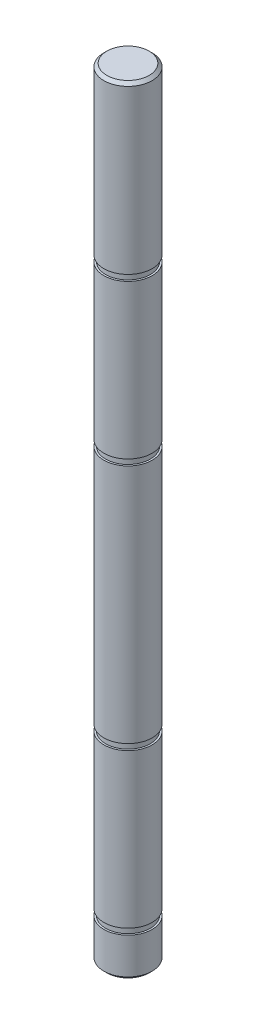
ISO-10303-21;
HEADER;
FILE_DESCRIPTION(('STEP AP214'),'2;1');
FILE_NAME('part.step','',(''),(''),'','','');
FILE_SCHEMA(('AUTOMOTIVE_DESIGN { 1 0 10303 214 1 1 1 1 }'));
ENDSEC;
DATA;
#1=APPLICATION_CONTEXT('core data for automotive mechanical design processes');
#2=APPLICATION_PROTOCOL_DEFINITION('international standard','automotive_design',2000,#1);
#3=PRODUCT_CONTEXT('',#1,'mechanical');
#4=PRODUCT('Part','Part','',(#3));
#5=PRODUCT_RELATED_PRODUCT_CATEGORY('part','',(#4));
#6=PRODUCT_DEFINITION_FORMATION('','',#4);
#7=PRODUCT_DEFINITION_CONTEXT('part definition',#1,'design');
#8=PRODUCT_DEFINITION('design','',#6,#7);
#9=PRODUCT_DEFINITION_SHAPE('','',#8);
#10=(LENGTH_UNIT() NAMED_UNIT(*) SI_UNIT(.MILLI.,.METRE.));
#11=(NAMED_UNIT(*) PLANE_ANGLE_UNIT() SI_UNIT($,.RADIAN.));
#12=(NAMED_UNIT(*) SI_UNIT($,.STERADIAN.) SOLID_ANGLE_UNIT());
#13=UNCERTAINTY_MEASURE_WITH_UNIT(LENGTH_MEASURE(1.E-05),#10,'distance_accuracy_value','');
#14=(GEOMETRIC_REPRESENTATION_CONTEXT(3) GLOBAL_UNCERTAINTY_ASSIGNED_CONTEXT((#13)) GLOBAL_UNIT_ASSIGNED_CONTEXT((#10,
#11,#12)) REPRESENTATION_CONTEXT('',''));
#15=CARTESIAN_POINT('',(0.,0.,0.));
#16=DIRECTION('',(0.,0.,1.));
#17=DIRECTION('',(1.,0.,0.));
#18=AXIS2_PLACEMENT_3D('',#15,#16,#17);
#19=CARTESIAN_POINT('',(0.,117.,0.));
#20=DIRECTION('',(0.,-1.,0.));
#21=DIRECTION('',(0.,0.,-1.));
#22=AXIS2_PLACEMENT_3D('',#19,#20,#21);
#23=CYLINDRICAL_SURFACE('',#22,4.);
#24=CARTESIAN_POINT('',(0.,29.13,0.));
#25=DIRECTION('',(0.,-1.,0.));
#26=DIRECTION('',(0.,0.,-1.));
#27=AXIS2_PLACEMENT_3D('',#24,#25,#26);
#28=CIRCLE('',#27,4.);
#29=CARTESIAN_POINT('',(0.,29.13,-4.));
#30=VERTEX_POINT('',#29);
#31=EDGE_CURVE('E81',#30,#30,#28,.T.);
#32=ORIENTED_EDGE('',*,*,#31,.F.);
#33=EDGE_LOOP('',(#32));
#34=FACE_BOUND('',#33,.T.);
#35=CARTESIAN_POINT('',(0.,69.,0.));
#36=DIRECTION('',(0.,1.,0.));
#37=DIRECTION('',(0.,0.,1.));
#38=AXIS2_PLACEMENT_3D('',#35,#36,#37);
#39=CIRCLE('',#38,4.);
#40=CARTESIAN_POINT('',(0.,69.,4.));
#41=VERTEX_POINT('',#40);
#42=EDGE_CURVE('E93',#41,#41,#39,.T.);
#43=ORIENTED_EDGE('',*,*,#42,.F.);
#44=EDGE_LOOP('',(#43));
#45=FACE_BOUND('',#44,.T.);
#46=ADVANCED_FACE('F39',(#34,#45),#23,.T.);
#47=CARTESIAN_POINT('',(0.,29.13,0.));
#48=DIRECTION('',(0.,-1.,0.));
#49=DIRECTION('',(0.,0.,-1.));
#50=AXIS2_PLACEMENT_3D('',#47,#48,#49);
#51=PLANE('',#50);
#52=CARTESIAN_POINT('',(0.,29.13,0.));
#53=DIRECTION('',(0.,-1.,0.));
#54=DIRECTION('',(0.,0.,-1.));
#55=AXIS2_PLACEMENT_3D('',#52,#53,#54);
#56=CIRCLE('',#55,3.7);
#57=CARTESIAN_POINT('',(0.,29.13,-3.7));
#58=VERTEX_POINT('',#57);
#59=EDGE_CURVE('E87',#58,#58,#56,.T.);
#60=ORIENTED_EDGE('',*,*,#59,.F.);
#61=EDGE_LOOP('',(#60));
#62=FACE_BOUND('',#61,.T.);
#63=ORIENTED_EDGE('',*,*,#31,.T.);
#64=EDGE_LOOP('',(#63));
#65=FACE_BOUND('',#64,.T.);
#66=ADVANCED_FACE('F120',(#62,#65),#51,.T.);
#67=CARTESIAN_POINT('',(0.,28.13,0.));
#68=DIRECTION('',(0.,-1.,0.));
#69=DIRECTION('',(0.,0.,-1.));
#70=AXIS2_PLACEMENT_3D('',#67,#68,#69);
#71=PLANE('',#70);
#72=CARTESIAN_POINT('',(0.,28.13,0.));
#73=DIRECTION('',(0.,-1.,0.));
#74=DIRECTION('',(0.,0.,-1.));
#75=AXIS2_PLACEMENT_3D('',#72,#73,#74);
#76=CIRCLE('',#75,3.7);
#77=CARTESIAN_POINT('',(0.,28.13,-3.7));
#78=VERTEX_POINT('',#77);
#79=EDGE_CURVE('E90',#78,#78,#76,.T.);
#80=ORIENTED_EDGE('',*,*,#79,.T.);
#81=EDGE_LOOP('',(#80));
#82=FACE_BOUND('',#81,.T.);
#83=CARTESIAN_POINT('',(0.,28.13,0.));
#84=DIRECTION('',(0.,-1.,0.));
#85=DIRECTION('',(0.,0.,-1.));
#86=AXIS2_PLACEMENT_3D('',#83,#84,#85);
#87=CIRCLE('',#86,4.);
#88=CARTESIAN_POINT('',(0.,28.13,-4.));
#89=VERTEX_POINT('',#88);
#90=EDGE_CURVE('E84',#89,#89,#87,.T.);
#91=ORIENTED_EDGE('',*,*,#90,.F.);
#92=EDGE_LOOP('',(#91));
#93=FACE_BOUND('',#92,.T.);
#94=ADVANCED_FACE('F129',(#82,#93),#71,.F.);
#95=CARTESIAN_POINT('',(0.,29.13,0.));
#96=DIRECTION('',(0.,-1.,0.));
#97=DIRECTION('',(0.,0.,-1.));
#98=AXIS2_PLACEMENT_3D('',#95,#96,#97);
#99=CYLINDRICAL_SURFACE('',#98,3.7);
#100=ORIENTED_EDGE('',*,*,#59,.T.);
#101=EDGE_LOOP('',(#100));
#102=FACE_BOUND('',#101,.T.);
#103=ORIENTED_EDGE('',*,*,#79,.F.);
#104=EDGE_LOOP('',(#103));
#105=FACE_BOUND('',#104,.T.);
#106=ADVANCED_FACE('F151',(#102,#105),#99,.T.);
#107=CARTESIAN_POINT('',(0.,-4.87,0.));
#108=DIRECTION('',(0.,-1.,0.));
#109=DIRECTION('',(0.,0.,-1.));
#110=AXIS2_PLACEMENT_3D('',#107,#108,#109);
#111=PLANE('',#110);
#112=CARTESIAN_POINT('',(0.,-4.87,0.));
#113=DIRECTION('',(0.,-1.,0.));
#114=DIRECTION('',(0.,0.,-1.));
#115=AXIS2_PLACEMENT_3D('',#112,#113,#114);
#116=CIRCLE('',#115,3.5);
#117=CARTESIAN_POINT('',(0.,-4.87,-3.5));
#118=VERTEX_POINT('',#117);
#119=EDGE_CURVE('E54',#118,#118,#116,.T.);
#120=ORIENTED_EDGE('',*,*,#119,.T.);
#121=EDGE_LOOP('',(#120));
#122=FACE_BOUND('',#121,.T.);
#123=ADVANCED_FACE('F140',(#122),#111,.T.);
#124=CARTESIAN_POINT('',(0.,-4.37,0.));
#125=DIRECTION('',(0.,-1.,0.));
#126=DIRECTION('',(0.,0.,-1.));
#127=AXIS2_PLACEMENT_3D('',#124,#125,#126);
#128=CIRCLE('',#127,4.);
#129=CARTESIAN_POINT('',(0.,-4.37,-4.));
#130=VERTEX_POINT('',#129);
#131=EDGE_CURVE('E50',#130,#130,#128,.F.);
#132=ORIENTED_EDGE('',*,*,#131,.T.);
#133=EDGE_LOOP('',(#132));
#134=FACE_BOUND('',#133,.T.);
#135=CARTESIAN_POINT('',(0.,1.63,0.));
#136=DIRECTION('',(0.,-1.,0.));
#137=DIRECTION('',(0.,0.,-1.));
#138=AXIS2_PLACEMENT_3D('',#135,#136,#137);
#139=CIRCLE('',#138,4.);
#140=CARTESIAN_POINT('',(0.,1.63,-4.));
#141=VERTEX_POINT('',#140);
#142=EDGE_CURVE('E59',#141,#141,#139,.T.);
#143=ORIENTED_EDGE('',*,*,#142,.T.);
#144=EDGE_LOOP('',(#143));
#145=FACE_BOUND('',#144,.T.);
#146=ADVANCED_FACE('F124',(#134,#145),#23,.T.);
#147=CARTESIAN_POINT('',(0.,1.63,0.));
#148=DIRECTION('',(0.,-1.,0.));
#149=DIRECTION('',(0.,0.,-1.));
#150=AXIS2_PLACEMENT_3D('',#147,#148,#149);
#151=PLANE('',#150);
#152=ORIENTED_EDGE('',*,*,#142,.F.);
#153=EDGE_LOOP('',(#152));
#154=FACE_BOUND('',#153,.T.);
#155=CARTESIAN_POINT('',(0.,1.63,0.));
#156=DIRECTION('',(0.,-1.,0.));
#157=DIRECTION('',(0.,0.,-1.));
#158=AXIS2_PLACEMENT_3D('',#155,#156,#157);
#159=CIRCLE('',#158,3.7);
#160=CARTESIAN_POINT('',(0.,1.63,-3.7));
#161=VERTEX_POINT('',#160);
#162=EDGE_CURVE('E63',#161,#161,#159,.T.);
#163=ORIENTED_EDGE('',*,*,#162,.T.);
#164=EDGE_LOOP('',(#163));
#165=FACE_BOUND('',#164,.T.);
#166=ADVANCED_FACE('F139',(#154,#165),#151,.F.);
#167=CARTESIAN_POINT('',(0.,1.63,0.));
#168=DIRECTION('',(0.,1.,0.));
#169=DIRECTION('',(0.,0.,1.));
#170=AXIS2_PLACEMENT_3D('',#167,#168,#169);
#171=CYLINDRICAL_SURFACE('',#170,3.7);
#172=ORIENTED_EDGE('',*,*,#162,.F.);
#173=EDGE_LOOP('',(#172));
#174=FACE_BOUND('',#173,.T.);
#175=CARTESIAN_POINT('',(0.,2.63,0.));
#176=DIRECTION('',(0.,-1.,0.));
#177=DIRECTION('',(0.,0.,-1.));
#178=AXIS2_PLACEMENT_3D('',#175,#176,#177);
#179=CIRCLE('',#178,3.7);
#180=CARTESIAN_POINT('',(0.,2.63,-3.7));
#181=VERTEX_POINT('',#180);
#182=EDGE_CURVE('E66',#181,#181,#179,.T.);
#183=ORIENTED_EDGE('',*,*,#182,.T.);
#184=EDGE_LOOP('',(#183));
#185=FACE_BOUND('',#184,.T.);
#186=ADVANCED_FACE('F148',(#174,#185),#171,.T.);
#187=CARTESIAN_POINT('',(0.,2.63,0.));
#188=DIRECTION('',(0.,-1.,0.));
#189=DIRECTION('',(0.,0.,-1.));
#190=AXIS2_PLACEMENT_3D('',#187,#188,#189);
#191=PLANE('',#190);
#192=CARTESIAN_POINT('',(0.,2.63,0.));
#193=DIRECTION('',(0.,-1.,0.));
#194=DIRECTION('',(0.,0.,-1.));
#195=AXIS2_PLACEMENT_3D('',#192,#193,#194);
#196=CIRCLE('',#195,4.);
#197=CARTESIAN_POINT('',(0.,2.63,-4.));
#198=VERTEX_POINT('',#197);
#199=EDGE_CURVE('E60',#198,#198,#196,.T.);
#200=ORIENTED_EDGE('',*,*,#199,.T.);
#201=EDGE_LOOP('',(#200));
#202=FACE_BOUND('',#201,.T.);
#203=ORIENTED_EDGE('',*,*,#182,.F.);
#204=EDGE_LOOP('',(#203));
#205=FACE_BOUND('',#204,.T.);
#206=ADVANCED_FACE('F166',(#202,#205),#191,.T.);
#207=ORIENTED_EDGE('',*,*,#90,.T.);
#208=EDGE_LOOP('',(#207));
#209=FACE_BOUND('',#208,.T.);
#210=ORIENTED_EDGE('',*,*,#199,.F.);
#211=EDGE_LOOP('',(#210));
#212=FACE_BOUND('',#211,.T.);
#213=ADVANCED_FACE('F115',(#209,#212),#23,.T.);
#214=CARTESIAN_POINT('',(0.,69.,0.));
#215=DIRECTION('',(0.,1.,0.));
#216=DIRECTION('',(0.,0.,1.));
#217=AXIS2_PLACEMENT_3D('',#214,#215,#216);
#218=PLANE('',#217);
#219=CARTESIAN_POINT('',(0.,69.,0.));
#220=DIRECTION('',(0.,1.,0.));
#221=DIRECTION('',(0.,0.,1.));
#222=AXIS2_PLACEMENT_3D('',#219,#220,#221);
#223=CIRCLE('',#222,3.7);
#224=CARTESIAN_POINT('',(0.,69.,3.7));
#225=VERTEX_POINT('',#224);
#226=EDGE_CURVE('E99',#225,#225,#223,.T.);
#227=ORIENTED_EDGE('',*,*,#226,.F.);
#228=EDGE_LOOP('',(#227));
#229=FACE_BOUND('',#228,.T.);
#230=ORIENTED_EDGE('',*,*,#42,.T.);
#231=EDGE_LOOP('',(#230));
#232=FACE_BOUND('',#231,.T.);
#233=ADVANCED_FACE('F111',(#229,#232),#218,.T.);
#234=CARTESIAN_POINT('',(0.,70.,0.));
#235=DIRECTION('',(0.,1.,0.));
#236=DIRECTION('',(0.,0.,1.));
#237=AXIS2_PLACEMENT_3D('',#234,#235,#236);
#238=PLANE('',#237);
#239=CARTESIAN_POINT('',(0.,70.,0.));
#240=DIRECTION('',(0.,1.,0.));
#241=DIRECTION('',(0.,0.,1.));
#242=AXIS2_PLACEMENT_3D('',#239,#240,#241);
#243=CIRCLE('',#242,3.7);
#244=CARTESIAN_POINT('',(0.,70.,3.7));
#245=VERTEX_POINT('',#244);
#246=EDGE_CURVE('E102',#245,#245,#243,.T.);
#247=ORIENTED_EDGE('',*,*,#246,.T.);
#248=EDGE_LOOP('',(#247));
#249=FACE_BOUND('',#248,.T.);
#250=CARTESIAN_POINT('',(0.,70.,0.));
#251=DIRECTION('',(0.,1.,0.));
#252=DIRECTION('',(0.,0.,1.));
#253=AXIS2_PLACEMENT_3D('',#250,#251,#252);
#254=CIRCLE('',#253,4.);
#255=CARTESIAN_POINT('',(0.,70.,4.));
#256=VERTEX_POINT('',#255);
#257=EDGE_CURVE('E96',#256,#256,#254,.T.);
#258=ORIENTED_EDGE('',*,*,#257,.F.);
#259=EDGE_LOOP('',(#258));
#260=FACE_BOUND('',#259,.T.);
#261=ADVANCED_FACE('F114',(#249,#260),#238,.F.);
#262=CARTESIAN_POINT('',(0.,69.,0.));
#263=DIRECTION('',(0.,1.,0.));
#264=DIRECTION('',(0.,0.,1.));
#265=AXIS2_PLACEMENT_3D('',#262,#263,#264);
#266=CYLINDRICAL_SURFACE('',#265,3.7);
#267=ORIENTED_EDGE('',*,*,#226,.T.);
#268=EDGE_LOOP('',(#267));
#269=FACE_BOUND('',#268,.T.);
#270=ORIENTED_EDGE('',*,*,#246,.F.);
#271=EDGE_LOOP('',(#270));
#272=FACE_BOUND('',#271,.T.);
#273=ADVANCED_FACE('F108',(#269,#272),#266,.T.);
#274=CARTESIAN_POINT('',(0.,124.,0.));
#275=DIRECTION('',(0.,1.,0.));
#276=DIRECTION('',(0.,0.,1.));
#277=AXIS2_PLACEMENT_3D('',#274,#275,#276);
#278=PLANE('',#277);
#279=CARTESIAN_POINT('',(0.,124.,0.));
#280=DIRECTION('',(0.,1.,0.));
#281=DIRECTION('',(0.,0.,1.));
#282=AXIS2_PLACEMENT_3D('',#279,#280,#281);
#283=CIRCLE('',#282,3.5);
#284=CARTESIAN_POINT('',(0.,124.,3.5));
#285=VERTEX_POINT('',#284);
#286=EDGE_CURVE('E46',#285,#285,#283,.T.);
#287=ORIENTED_EDGE('',*,*,#286,.T.);
#288=EDGE_LOOP('',(#287));
#289=FACE_BOUND('',#288,.T.);
#290=ADVANCED_FACE('F157',(#289),#278,.T.);
#291=CARTESIAN_POINT('',(0.,123.5,0.));
#292=DIRECTION('',(0.,1.,0.));
#293=DIRECTION('',(0.,0.,1.));
#294=AXIS2_PLACEMENT_3D('',#291,#292,#293);
#295=CIRCLE('',#294,4.);
#296=CARTESIAN_POINT('',(0.,123.5,4.));
#297=VERTEX_POINT('',#296);
#298=EDGE_CURVE('E10',#297,#297,#295,.F.);
#299=ORIENTED_EDGE('',*,*,#298,.T.);
#300=EDGE_LOOP('',(#299));
#301=FACE_BOUND('',#300,.T.);
#302=CARTESIAN_POINT('',(0.,96.5,0.));
#303=DIRECTION('',(0.,1.,0.));
#304=DIRECTION('',(0.,0.,1.));
#305=AXIS2_PLACEMENT_3D('',#302,#303,#304);
#306=CIRCLE('',#305,4.);
#307=CARTESIAN_POINT('',(0.,96.5,4.));
#308=VERTEX_POINT('',#307);
#309=EDGE_CURVE('E69',#308,#308,#306,.T.);
#310=ORIENTED_EDGE('',*,*,#309,.T.);
#311=EDGE_LOOP('',(#310));
#312=FACE_BOUND('',#311,.T.);
#313=ADVANCED_FACE('F142',(#301,#312),#23,.T.);
#314=CARTESIAN_POINT('',(0.,96.5,0.));
#315=DIRECTION('',(0.,1.,0.));
#316=DIRECTION('',(0.,0.,1.));
#317=AXIS2_PLACEMENT_3D('',#314,#315,#316);
#318=PLANE('',#317);
#319=ORIENTED_EDGE('',*,*,#309,.F.);
#320=EDGE_LOOP('',(#319));
#321=FACE_BOUND('',#320,.T.);
#322=CARTESIAN_POINT('',(0.,96.5,0.));
#323=DIRECTION('',(0.,1.,0.));
#324=DIRECTION('',(0.,0.,1.));
#325=AXIS2_PLACEMENT_3D('',#322,#323,#324);
#326=CIRCLE('',#325,3.7);
#327=CARTESIAN_POINT('',(0.,96.5,3.7));
#328=VERTEX_POINT('',#327);
#329=EDGE_CURVE('E75',#328,#328,#326,.T.);
#330=ORIENTED_EDGE('',*,*,#329,.T.);
#331=EDGE_LOOP('',(#330));
#332=FACE_BOUND('',#331,.T.);
#333=ADVANCED_FACE('F156',(#321,#332),#318,.F.);
#334=CARTESIAN_POINT('',(0.,96.5,0.));
#335=DIRECTION('',(0.,-1.,0.));
#336=DIRECTION('',(0.,0.,-1.));
#337=AXIS2_PLACEMENT_3D('',#334,#335,#336);
#338=CYLINDRICAL_SURFACE('',#337,3.7);
#339=ORIENTED_EDGE('',*,*,#329,.F.);
#340=EDGE_LOOP('',(#339));
#341=FACE_BOUND('',#340,.T.);
#342=CARTESIAN_POINT('',(0.,95.5,0.));
#343=DIRECTION('',(0.,1.,0.));
#344=DIRECTION('',(0.,0.,1.));
#345=AXIS2_PLACEMENT_3D('',#342,#343,#344);
#346=CIRCLE('',#345,3.7);
#347=CARTESIAN_POINT('',(0.,95.5,3.7));
#348=VERTEX_POINT('',#347);
#349=EDGE_CURVE('E78',#348,#348,#346,.T.);
#350=ORIENTED_EDGE('',*,*,#349,.T.);
#351=EDGE_LOOP('',(#350));
#352=FACE_BOUND('',#351,.T.);
#353=ADVANCED_FACE('F162',(#341,#352),#338,.T.);
#354=CARTESIAN_POINT('',(0.,95.5,0.));
#355=DIRECTION('',(0.,1.,0.));
#356=DIRECTION('',(0.,0.,1.));
#357=AXIS2_PLACEMENT_3D('',#354,#355,#356);
#358=PLANE('',#357);
#359=CARTESIAN_POINT('',(0.,95.5,0.));
#360=DIRECTION('',(0.,1.,0.));
#361=DIRECTION('',(0.,0.,1.));
#362=AXIS2_PLACEMENT_3D('',#359,#360,#361);
#363=CIRCLE('',#362,4.);
#364=CARTESIAN_POINT('',(0.,95.5,4.));
#365=VERTEX_POINT('',#364);
#366=EDGE_CURVE('E72',#365,#365,#363,.T.);
#367=ORIENTED_EDGE('',*,*,#366,.T.);
#368=EDGE_LOOP('',(#367));
#369=FACE_BOUND('',#368,.T.);
#370=ORIENTED_EDGE('',*,*,#349,.F.);
#371=EDGE_LOOP('',(#370));
#372=FACE_BOUND('',#371,.T.);
#373=ADVANCED_FACE('F136',(#369,#372),#358,.T.);
#374=ORIENTED_EDGE('',*,*,#257,.T.);
#375=EDGE_LOOP('',(#374));
#376=FACE_BOUND('',#375,.T.);
#377=ORIENTED_EDGE('',*,*,#366,.F.);
#378=EDGE_LOOP('',(#377));
#379=FACE_BOUND('',#378,.T.);
#380=ADVANCED_FACE('F123',(#376,#379),#23,.T.);
#381=CARTESIAN_POINT('',(0.,-4.87,0.));
#382=DIRECTION('',(0.,1.,0.));
#383=DIRECTION('',(0.,0.,1.));
#384=AXIS2_PLACEMENT_3D('',#381,#382,#383);
#385=CONICAL_SURFACE('',#384,3.5,0.785398163397445);
#386=ORIENTED_EDGE('',*,*,#131,.F.);
#387=EDGE_LOOP('',(#386));
#388=FACE_BOUND('',#387,.T.);
#389=ORIENTED_EDGE('',*,*,#119,.F.);
#390=EDGE_LOOP('',(#389));
#391=FACE_BOUND('',#390,.T.);
#392=ADVANCED_FACE('F135',(#388,#391),#385,.T.);
#393=CARTESIAN_POINT('',(0.,124.,0.));
#394=DIRECTION('',(0.,-1.,0.));
#395=DIRECTION('',(0.,0.,-1.));
#396=AXIS2_PLACEMENT_3D('',#393,#394,#395);
#397=CONICAL_SURFACE('',#396,3.5,0.785398163397445);
#398=ORIENTED_EDGE('',*,*,#298,.F.);
#399=EDGE_LOOP('',(#398));
#400=FACE_BOUND('',#399,.T.);
#401=ORIENTED_EDGE('',*,*,#286,.F.);
#402=EDGE_LOOP('',(#401));
#403=FACE_BOUND('',#402,.T.);
#404=ADVANCED_FACE('F41',(#400,#403),#397,.T.);
#405=CLOSED_SHELL('',(#46,#66,#94,#106,#123,#146,#166,#186,#206,#213,#233,#261,#273,#290,#313,
#333,#353,#373,#380,#392,#404));
#406=MANIFOLD_SOLID_BREP('B2',#405);
#407=ADVANCED_BREP_SHAPE_REPRESENTATION('',(#18,#406),#14);
#408=SHAPE_DEFINITION_REPRESENTATION(#9,#407);
ENDSEC;
END-ISO-10303-21;
